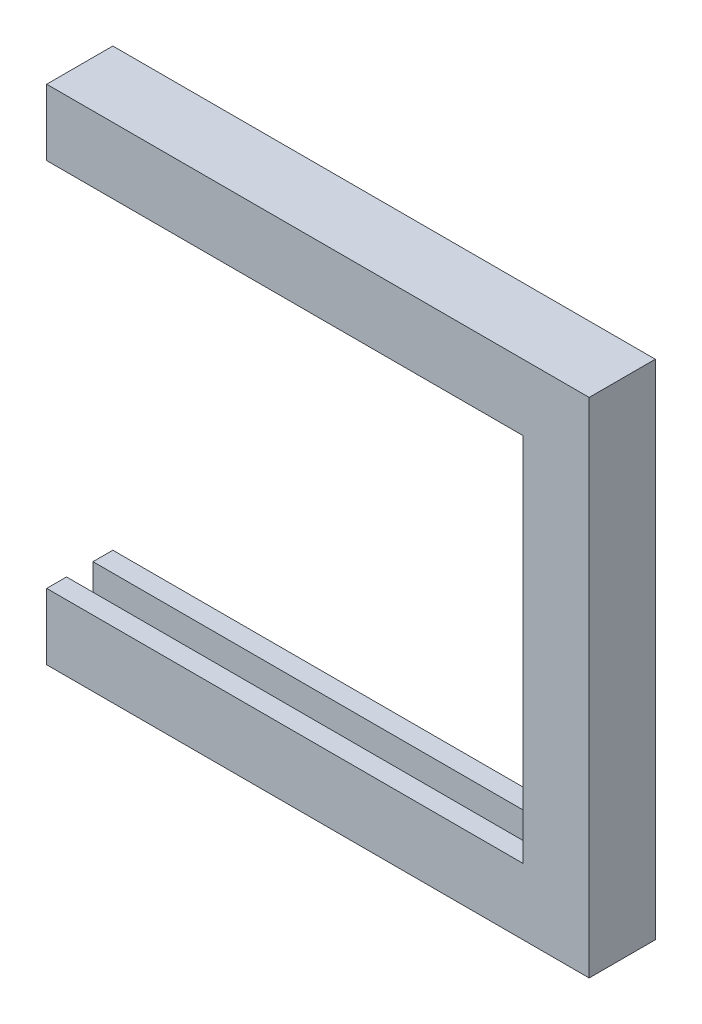
ISO-10303-21;
HEADER;
FILE_DESCRIPTION(('STEP AP214'),'2;1');
FILE_NAME('part.step','',(''),(''),'','','');
FILE_SCHEMA(('AUTOMOTIVE_DESIGN { 1 0 10303 214 1 1 1 1 }'));
ENDSEC;
DATA;
#1=APPLICATION_CONTEXT('core data for automotive mechanical design processes');
#2=APPLICATION_PROTOCOL_DEFINITION('international standard','automotive_design',2000,#1);
#3=PRODUCT_CONTEXT('',#1,'mechanical');
#4=PRODUCT('Part','Part','',(#3));
#5=PRODUCT_RELATED_PRODUCT_CATEGORY('part','',(#4));
#6=PRODUCT_DEFINITION_FORMATION('','',#4);
#7=PRODUCT_DEFINITION_CONTEXT('part definition',#1,'design');
#8=PRODUCT_DEFINITION('design','',#6,#7);
#9=PRODUCT_DEFINITION_SHAPE('','',#8);
#10=(LENGTH_UNIT() NAMED_UNIT(*) SI_UNIT(.MILLI.,.METRE.));
#11=(NAMED_UNIT(*) PLANE_ANGLE_UNIT() SI_UNIT($,.RADIAN.));
#12=(NAMED_UNIT(*) SI_UNIT($,.STERADIAN.) SOLID_ANGLE_UNIT());
#13=UNCERTAINTY_MEASURE_WITH_UNIT(LENGTH_MEASURE(1.E-05),#10,'distance_accuracy_value','');
#14=(GEOMETRIC_REPRESENTATION_CONTEXT(3) GLOBAL_UNCERTAINTY_ASSIGNED_CONTEXT((#13)) GLOBAL_UNIT_ASSIGNED_CONTEXT((#10,
#11,#12)) REPRESENTATION_CONTEXT('',''));
#15=CARTESIAN_POINT('',(0.,0.,0.));
#16=DIRECTION('',(0.,0.,1.));
#17=DIRECTION('',(1.,0.,0.));
#18=AXIS2_PLACEMENT_3D('',#15,#16,#17);
#19=CARTESIAN_POINT('',(0.,0.,5.));
#20=DIRECTION('',(1.,0.,0.));
#21=DIRECTION('',(0.,0.,-1.));
#22=AXIS2_PLACEMENT_3D('',#19,#20,#21);
#23=PLANE('',#22);
#24=DIRECTION('',(0.,-1.,0.));
#25=VECTOR('',#24,1.);
#26=CARTESIAN_POINT('',(0.,0.,5.));
#27=LINE('',#26,#25);
#28=CARTESIAN_POINT('',(0.,5.,5.));
#29=VERTEX_POINT('',#28);
#30=CARTESIAN_POINT('',(0.,0.,5.));
#31=VERTEX_POINT('',#30);
#32=EDGE_CURVE('E224',#29,#31,#27,.T.);
#33=ORIENTED_EDGE('',*,*,#32,.F.);
#34=DIRECTION('',(0.,0.,1.));
#35=VECTOR('',#34,1.);
#36=CARTESIAN_POINT('',(0.,5.,0.));
#37=LINE('',#36,#35);
#38=CARTESIAN_POINT('',(0.,5.,3.5));
#39=VERTEX_POINT('',#38);
#40=EDGE_CURVE('E270',#39,#29,#37,.T.);
#41=ORIENTED_EDGE('',*,*,#40,.F.);
#42=DIRECTION('',(0.,1.,0.));
#43=VECTOR('',#42,1.);
#44=CARTESIAN_POINT('',(0.,3.,3.5));
#45=LINE('',#44,#43);
#46=CARTESIAN_POINT('',(0.,3.,3.5));
#47=VERTEX_POINT('',#46);
#48=EDGE_CURVE('E198',#47,#39,#45,.T.);
#49=ORIENTED_EDGE('',*,*,#48,.F.);
#50=DIRECTION('',(0.,0.,1.));
#51=VECTOR('',#50,1.);
#52=CARTESIAN_POINT('',(0.,3.,3.5));
#53=LINE('',#52,#51);
#54=CARTESIAN_POINT('',(0.,3.,1.5));
#55=VERTEX_POINT('',#54);
#56=EDGE_CURVE('E208',#55,#47,#53,.T.);
#57=ORIENTED_EDGE('',*,*,#56,.F.);
#58=DIRECTION('',(0.,-1.,0.));
#59=VECTOR('',#58,1.);
#60=CARTESIAN_POINT('',(0.,3.,1.5));
#61=LINE('',#60,#59);
#62=CARTESIAN_POINT('',(0.,5.,1.5));
#63=VERTEX_POINT('',#62);
#64=EDGE_CURVE('E204',#63,#55,#61,.T.);
#65=ORIENTED_EDGE('',*,*,#64,.F.);
#66=CARTESIAN_POINT('',(0.,5.,0.));
#67=VERTEX_POINT('',#66);
#68=EDGE_CURVE('E257',#67,#63,#37,.T.);
#69=ORIENTED_EDGE('',*,*,#68,.F.);
#70=DIRECTION('',(0.,-1.,0.));
#71=VECTOR('',#70,1.);
#72=CARTESIAN_POINT('',(0.,0.,0.));
#73=LINE('',#72,#71);
#74=CARTESIAN_POINT('',(0.,0.,0.));
#75=VERTEX_POINT('',#74);
#76=EDGE_CURVE('E167',#67,#75,#73,.T.);
#77=ORIENTED_EDGE('',*,*,#76,.T.);
#78=DIRECTION('',(0.,0.,-1.));
#79=VECTOR('',#78,1.);
#80=CARTESIAN_POINT('',(0.,0.,5.));
#81=LINE('',#80,#79);
#82=EDGE_CURVE('E248',#31,#75,#81,.T.);
#83=ORIENTED_EDGE('',*,*,#82,.F.);
#84=EDGE_LOOP('',(#33,#41,#49,#57,#65,#69,#77,#83));
#85=FACE_BOUND('',#84,.T.);
#86=ADVANCED_FACE('F35',(#85),#23,.F.);
#87=CARTESIAN_POINT('',(0.,38.,0.));
#88=VERTEX_POINT('',#87);
#89=CARTESIAN_POINT('',(0.,33.,0.));
#90=VERTEX_POINT('',#89);
#91=EDGE_CURVE('E231',#88,#90,#73,.T.);
#92=ORIENTED_EDGE('',*,*,#91,.T.);
#93=DIRECTION('',(0.,0.,-1.));
#94=VECTOR('',#93,1.);
#95=CARTESIAN_POINT('',(0.,33.,0.));
#96=LINE('',#95,#94);
#97=CARTESIAN_POINT('',(0.,33.,1.5));
#98=VERTEX_POINT('',#97);
#99=EDGE_CURVE('E273',#98,#90,#96,.T.);
#100=ORIENTED_EDGE('',*,*,#99,.F.);
#101=CARTESIAN_POINT('',(0.,35.,1.5));
#102=VERTEX_POINT('',#101);
#103=EDGE_CURVE('E205',#102,#98,#61,.T.);
#104=ORIENTED_EDGE('',*,*,#103,.F.);
#105=DIRECTION('',(0.,0.,-1.));
#106=VECTOR('',#105,1.);
#107=CARTESIAN_POINT('',(0.,35.,3.49999999999999));
#108=LINE('',#107,#106);
#109=CARTESIAN_POINT('',(0.,35.,3.49999999999999));
#110=VERTEX_POINT('',#109);
#111=EDGE_CURVE('E201',#110,#102,#108,.T.);
#112=ORIENTED_EDGE('',*,*,#111,.F.);
#113=CARTESIAN_POINT('',(0.,33.,3.49999999999999));
#114=VERTEX_POINT('',#113);
#115=EDGE_CURVE('E183',#114,#110,#45,.T.);
#116=ORIENTED_EDGE('',*,*,#115,.F.);
#117=CARTESIAN_POINT('',(0.,33.,5.));
#118=VERTEX_POINT('',#117);
#119=EDGE_CURVE('E275',#118,#114,#96,.T.);
#120=ORIENTED_EDGE('',*,*,#119,.F.);
#121=CARTESIAN_POINT('',(0.,38.,5.));
#122=VERTEX_POINT('',#121);
#123=EDGE_CURVE('E220',#122,#118,#27,.T.);
#124=ORIENTED_EDGE('',*,*,#123,.F.);
#125=DIRECTION('',(0.,0.,-1.));
#126=VECTOR('',#125,1.);
#127=CARTESIAN_POINT('',(0.,38.,5.));
#128=LINE('',#127,#126);
#129=EDGE_CURVE('E230',#122,#88,#128,.T.);
#130=ORIENTED_EDGE('',*,*,#129,.T.);
#131=EDGE_LOOP('',(#92,#100,#104,#112,#116,#120,#124,#130));
#132=FACE_BOUND('',#131,.T.);
#133=ADVANCED_FACE('F37',(#132),#23,.F.);
#134=CARTESIAN_POINT('',(0.,0.,5.));
#135=DIRECTION('',(0.,1.,0.));
#136=DIRECTION('',(0.,0.,1.));
#137=AXIS2_PLACEMENT_3D('',#134,#135,#136);
#138=PLANE('',#137);
#139=DIRECTION('',(1.,0.,0.));
#140=VECTOR('',#139,1.);
#141=CARTESIAN_POINT('',(0.,0.,0.));
#142=LINE('',#141,#140);
#143=CARTESIAN_POINT('',(41.,0.,0.));
#144=VERTEX_POINT('',#143);
#145=EDGE_CURVE('E234',#75,#144,#142,.T.);
#146=ORIENTED_EDGE('',*,*,#145,.T.);
#147=DIRECTION('',(0.,0.,-1.));
#148=VECTOR('',#147,1.);
#149=CARTESIAN_POINT('',(41.,0.,5.));
#150=LINE('',#149,#148);
#151=CARTESIAN_POINT('',(41.,0.,5.));
#152=VERTEX_POINT('',#151);
#153=EDGE_CURVE('E245',#152,#144,#150,.T.);
#154=ORIENTED_EDGE('',*,*,#153,.F.);
#155=DIRECTION('',(1.,0.,0.));
#156=VECTOR('',#155,1.);
#157=CARTESIAN_POINT('',(0.,0.,5.));
#158=LINE('',#157,#156);
#159=EDGE_CURVE('E223',#31,#152,#158,.T.);
#160=ORIENTED_EDGE('',*,*,#159,.F.);
#161=ORIENTED_EDGE('',*,*,#82,.T.);
#162=EDGE_LOOP('',(#146,#154,#160,#161));
#163=FACE_BOUND('',#162,.T.);
#164=ADVANCED_FACE('F324',(#163),#138,.F.);
#165=CARTESIAN_POINT('',(41.,0.,5.));
#166=DIRECTION('',(-1.,0.,0.));
#167=DIRECTION('',(0.,0.,1.));
#168=AXIS2_PLACEMENT_3D('',#165,#166,#167);
#169=PLANE('',#168);
#170=DIRECTION('',(0.,1.,0.));
#171=VECTOR('',#170,1.);
#172=CARTESIAN_POINT('',(41.,0.,0.));
#173=LINE('',#172,#171);
#174=CARTESIAN_POINT('',(41.,38.,0.));
#175=VERTEX_POINT('',#174);
#176=EDGE_CURVE('E236',#144,#175,#173,.T.);
#177=ORIENTED_EDGE('',*,*,#176,.T.);
#178=DIRECTION('',(0.,0.,-1.));
#179=VECTOR('',#178,1.);
#180=CARTESIAN_POINT('',(41.,38.,5.));
#181=LINE('',#180,#179);
#182=CARTESIAN_POINT('',(41.,38.,5.));
#183=VERTEX_POINT('',#182);
#184=EDGE_CURVE('E242',#183,#175,#181,.T.);
#185=ORIENTED_EDGE('',*,*,#184,.F.);
#186=DIRECTION('',(0.,1.,0.));
#187=VECTOR('',#186,1.);
#188=CARTESIAN_POINT('',(41.,0.,5.));
#189=LINE('',#188,#187);
#190=EDGE_CURVE('E226',#152,#183,#189,.T.);
#191=ORIENTED_EDGE('',*,*,#190,.F.);
#192=ORIENTED_EDGE('',*,*,#153,.T.);
#193=EDGE_LOOP('',(#177,#185,#191,#192));
#194=FACE_BOUND('',#193,.T.);
#195=ADVANCED_FACE('F328',(#194),#169,.F.);
#196=CARTESIAN_POINT('',(0.,38.,5.));
#197=DIRECTION('',(0.,-1.,0.));
#198=DIRECTION('',(0.,0.,-1.));
#199=AXIS2_PLACEMENT_3D('',#196,#197,#198);
#200=PLANE('',#199);
#201=DIRECTION('',(-1.,0.,0.));
#202=VECTOR('',#201,1.);
#203=CARTESIAN_POINT('',(0.,38.,0.));
#204=LINE('',#203,#202);
#205=EDGE_CURVE('E238',#175,#88,#204,.T.);
#206=ORIENTED_EDGE('',*,*,#205,.T.);
#207=ORIENTED_EDGE('',*,*,#129,.F.);
#208=DIRECTION('',(-1.,0.,0.));
#209=VECTOR('',#208,1.);
#210=CARTESIAN_POINT('',(0.,38.,5.));
#211=LINE('',#210,#209);
#212=EDGE_CURVE('E228',#183,#122,#211,.T.);
#213=ORIENTED_EDGE('',*,*,#212,.F.);
#214=ORIENTED_EDGE('',*,*,#184,.T.);
#215=EDGE_LOOP('',(#206,#207,#213,#214));
#216=FACE_BOUND('',#215,.T.);
#217=ADVANCED_FACE('F292',(#216),#200,.F.);
#218=CARTESIAN_POINT('',(0.,0.,5.));
#219=DIRECTION('',(0.,0.,-1.));
#220=DIRECTION('',(-1.,0.,0.));
#221=AXIS2_PLACEMENT_3D('',#218,#219,#220);
#222=PLANE('',#221);
#223=DIRECTION('',(0.,-1.,0.));
#224=VECTOR('',#223,1.);
#225=CARTESIAN_POINT('',(36.,29.5,5.));
#226=LINE('',#225,#224);
#227=CARTESIAN_POINT('',(36.,33.,5.));
#228=VERTEX_POINT('',#227);
#229=CARTESIAN_POINT('',(36.,5.,5.));
#230=VERTEX_POINT('',#229);
#231=EDGE_CURVE('E153',#228,#230,#226,.T.);
#232=ORIENTED_EDGE('',*,*,#231,.T.);
#233=DIRECTION('',(-1.,0.,0.));
#234=VECTOR('',#233,1.);
#235=CARTESIAN_POINT('',(36.,5.,5.));
#236=LINE('',#235,#234);
#237=EDGE_CURVE('E168',#230,#29,#236,.T.);
#238=ORIENTED_EDGE('',*,*,#237,.T.);
#239=ORIENTED_EDGE('',*,*,#32,.T.);
#240=ORIENTED_EDGE('',*,*,#159,.T.);
#241=ORIENTED_EDGE('',*,*,#190,.T.);
#242=ORIENTED_EDGE('',*,*,#212,.T.);
#243=ORIENTED_EDGE('',*,*,#123,.T.);
#244=DIRECTION('',(-1.,0.,0.));
#245=VECTOR('',#244,1.);
#246=CARTESIAN_POINT('',(36.,33.,5.));
#247=LINE('',#246,#245);
#248=EDGE_CURVE('E171',#228,#118,#247,.T.);
#249=ORIENTED_EDGE('',*,*,#248,.F.);
#250=EDGE_LOOP('',(#232,#238,#239,#240,#241,#242,#243,#249));
#251=FACE_BOUND('',#250,.T.);
#252=ADVANCED_FACE('F286',(#251),#222,.F.);
#253=CARTESIAN_POINT('',(0.,0.,0.));
#254=DIRECTION('',(0.,0.,-1.));
#255=DIRECTION('',(-1.,0.,0.));
#256=AXIS2_PLACEMENT_3D('',#253,#254,#255);
#257=PLANE('',#256);
#258=DIRECTION('',(-1.,0.,0.));
#259=VECTOR('',#258,1.);
#260=CARTESIAN_POINT('',(36.,5.,0.));
#261=LINE('',#260,#259);
#262=CARTESIAN_POINT('',(36.,5.,0.));
#263=VERTEX_POINT('',#262);
#264=EDGE_CURVE('E158',#263,#67,#261,.T.);
#265=ORIENTED_EDGE('',*,*,#264,.F.);
#266=DIRECTION('',(0.,-1.,0.));
#267=VECTOR('',#266,1.);
#268=CARTESIAN_POINT('',(36.,29.5,0.));
#269=LINE('',#268,#267);
#270=CARTESIAN_POINT('',(36.,33.,0.));
#271=VERTEX_POINT('',#270);
#272=EDGE_CURVE('E145',#271,#263,#269,.T.);
#273=ORIENTED_EDGE('',*,*,#272,.F.);
#274=DIRECTION('',(-1.,0.,0.));
#275=VECTOR('',#274,1.);
#276=CARTESIAN_POINT('',(36.,33.,0.));
#277=LINE('',#276,#275);
#278=EDGE_CURVE('E180',#271,#90,#277,.T.);
#279=ORIENTED_EDGE('',*,*,#278,.T.);
#280=ORIENTED_EDGE('',*,*,#91,.F.);
#281=ORIENTED_EDGE('',*,*,#205,.F.);
#282=ORIENTED_EDGE('',*,*,#176,.F.);
#283=ORIENTED_EDGE('',*,*,#145,.F.);
#284=ORIENTED_EDGE('',*,*,#76,.F.);
#285=EDGE_LOOP('',(#265,#273,#279,#280,#281,#282,#283,#284));
#286=FACE_BOUND('',#285,.T.);
#287=ADVANCED_FACE('F165',(#286),#257,.T.);
#288=CARTESIAN_POINT('',(36.,29.5,5.));
#289=DIRECTION('',(1.,0.,0.));
#290=DIRECTION('',(0.,0.,-1.));
#291=AXIS2_PLACEMENT_3D('',#288,#289,#290);
#292=PLANE('',#291);
#293=ORIENTED_EDGE('',*,*,#272,.T.);
#294=DIRECTION('',(0.,0.,1.));
#295=VECTOR('',#294,1.);
#296=CARTESIAN_POINT('',(36.,5.,0.));
#297=LINE('',#296,#295);
#298=CARTESIAN_POINT('',(36.,5.,1.5));
#299=VERTEX_POINT('',#298);
#300=EDGE_CURVE('E57',#263,#299,#297,.T.);
#301=ORIENTED_EDGE('',*,*,#300,.T.);
#302=DIRECTION('',(0.,-1.,0.));
#303=VECTOR('',#302,1.);
#304=CARTESIAN_POINT('',(36.,3.,1.5));
#305=LINE('',#304,#303);
#306=CARTESIAN_POINT('',(36.,3.,1.5));
#307=VERTEX_POINT('',#306);
#308=EDGE_CURVE('E191',#299,#307,#305,.T.);
#309=ORIENTED_EDGE('',*,*,#308,.T.);
#310=DIRECTION('',(0.,0.,1.));
#311=VECTOR('',#310,1.);
#312=CARTESIAN_POINT('',(36.,3.,3.5));
#313=LINE('',#312,#311);
#314=CARTESIAN_POINT('',(36.,3.,3.5));
#315=VERTEX_POINT('',#314);
#316=EDGE_CURVE('E194',#307,#315,#313,.T.);
#317=ORIENTED_EDGE('',*,*,#316,.T.);
#318=DIRECTION('',(0.,1.,0.));
#319=VECTOR('',#318,1.);
#320=CARTESIAN_POINT('',(36.,3.,3.5));
#321=LINE('',#320,#319);
#322=CARTESIAN_POINT('',(36.,5.,3.5));
#323=VERTEX_POINT('',#322);
#324=EDGE_CURVE('E184',#315,#323,#321,.T.);
#325=ORIENTED_EDGE('',*,*,#324,.T.);
#326=EDGE_CURVE('E162',#323,#230,#297,.T.);
#327=ORIENTED_EDGE('',*,*,#326,.T.);
#328=ORIENTED_EDGE('',*,*,#231,.F.);
#329=DIRECTION('',(0.,0.,-1.));
#330=VECTOR('',#329,1.);
#331=CARTESIAN_POINT('',(36.,33.,0.));
#332=LINE('',#331,#330);
#333=CARTESIAN_POINT('',(36.,33.,3.49999999999999));
#334=VERTEX_POINT('',#333);
#335=EDGE_CURVE('E50',#228,#334,#332,.T.);
#336=ORIENTED_EDGE('',*,*,#335,.T.);
#337=CARTESIAN_POINT('',(36.,35.,3.49999999999999));
#338=VERTEX_POINT('',#337);
#339=EDGE_CURVE('E188',#334,#338,#321,.T.);
#340=ORIENTED_EDGE('',*,*,#339,.T.);
#341=DIRECTION('',(0.,0.,-1.));
#342=VECTOR('',#341,1.);
#343=CARTESIAN_POINT('',(36.,35.,3.49999999999999));
#344=LINE('',#343,#342);
#345=CARTESIAN_POINT('',(36.,35.,1.5));
#346=VERTEX_POINT('',#345);
#347=EDGE_CURVE('E187',#338,#346,#344,.T.);
#348=ORIENTED_EDGE('',*,*,#347,.T.);
#349=CARTESIAN_POINT('',(36.,33.,1.5));
#350=VERTEX_POINT('',#349);
#351=EDGE_CURVE('E192',#346,#350,#305,.T.);
#352=ORIENTED_EDGE('',*,*,#351,.T.);
#353=EDGE_CURVE('E148',#350,#271,#332,.T.);
#354=ORIENTED_EDGE('',*,*,#353,.T.);
#355=EDGE_LOOP('',(#293,#301,#309,#317,#325,#327,#328,#336,#340,#348,#352,#354));
#356=FACE_BOUND('',#355,.T.);
#357=ADVANCED_FACE('F146',(#356),#292,.F.);
#358=CARTESIAN_POINT('',(36.,3.,1.5));
#359=DIRECTION('',(0.,0.,-1.));
#360=DIRECTION('',(0.,1.,0.));
#361=AXIS2_PLACEMENT_3D('',#358,#359,#360);
#362=PLANE('',#361);
#363=ORIENTED_EDGE('',*,*,#103,.T.);
#364=DIRECTION('',(1.,0.,0.));
#365=VECTOR('',#364,1.);
#366=CARTESIAN_POINT('',(36.,33.,1.5));
#367=LINE('',#366,#365);
#368=EDGE_CURVE('E179',#98,#350,#367,.T.);
#369=ORIENTED_EDGE('',*,*,#368,.T.);
#370=ORIENTED_EDGE('',*,*,#351,.F.);
#371=DIRECTION('',(-1.,0.,0.));
#372=VECTOR('',#371,1.);
#373=CARTESIAN_POINT('',(36.,35.,1.5));
#374=LINE('',#373,#372);
#375=EDGE_CURVE('E215',#346,#102,#374,.T.);
#376=ORIENTED_EDGE('',*,*,#375,.T.);
#377=EDGE_LOOP('',(#363,#369,#370,#376));
#378=FACE_BOUND('',#377,.T.);
#379=ADVANCED_FACE('F301',(#378),#362,.F.);
#380=CARTESIAN_POINT('',(36.,3.,3.5));
#381=DIRECTION('',(0.,0.,1.));
#382=DIRECTION('',(0.,-1.,0.));
#383=AXIS2_PLACEMENT_3D('',#380,#381,#382);
#384=PLANE('',#383);
#385=ORIENTED_EDGE('',*,*,#339,.F.);
#386=DIRECTION('',(-1.,0.,0.));
#387=VECTOR('',#386,1.);
#388=CARTESIAN_POINT('',(36.,33.,3.49999999999999));
#389=LINE('',#388,#387);
#390=EDGE_CURVE('E11',#334,#114,#389,.T.);
#391=ORIENTED_EDGE('',*,*,#390,.T.);
#392=ORIENTED_EDGE('',*,*,#115,.T.);
#393=DIRECTION('',(-1.,0.,0.));
#394=VECTOR('',#393,1.);
#395=CARTESIAN_POINT('',(36.,35.,3.49999999999999));
#396=LINE('',#395,#394);
#397=EDGE_CURVE('E197',#338,#110,#396,.T.);
#398=ORIENTED_EDGE('',*,*,#397,.F.);
#399=EDGE_LOOP('',(#385,#391,#392,#398));
#400=FACE_BOUND('',#399,.T.);
#401=ADVANCED_FACE('F309',(#400),#384,.F.);
#402=CARTESIAN_POINT('',(36.,35.,3.49999999999999));
#403=DIRECTION('',(0.,1.,0.));
#404=DIRECTION('',(0.,0.,1.));
#405=AXIS2_PLACEMENT_3D('',#402,#403,#404);
#406=PLANE('',#405);
#407=ORIENTED_EDGE('',*,*,#111,.T.);
#408=ORIENTED_EDGE('',*,*,#375,.F.);
#409=ORIENTED_EDGE('',*,*,#347,.F.);
#410=ORIENTED_EDGE('',*,*,#397,.T.);
#411=EDGE_LOOP('',(#407,#408,#409,#410));
#412=FACE_BOUND('',#411,.T.);
#413=ADVANCED_FACE('F305',(#412),#406,.F.);
#414=ORIENTED_EDGE('',*,*,#48,.T.);
#415=DIRECTION('',(1.,0.,0.));
#416=VECTOR('',#415,1.);
#417=CARTESIAN_POINT('',(36.,5.,3.5));
#418=LINE('',#417,#416);
#419=EDGE_CURVE('E176',#39,#323,#418,.T.);
#420=ORIENTED_EDGE('',*,*,#419,.T.);
#421=ORIENTED_EDGE('',*,*,#324,.F.);
#422=DIRECTION('',(-1.,0.,0.));
#423=VECTOR('',#422,1.);
#424=CARTESIAN_POINT('',(36.,3.,3.5));
#425=LINE('',#424,#423);
#426=EDGE_CURVE('E154',#315,#47,#425,.T.);
#427=ORIENTED_EDGE('',*,*,#426,.T.);
#428=EDGE_LOOP('',(#414,#420,#421,#427));
#429=FACE_BOUND('',#428,.T.);
#430=ADVANCED_FACE('F267',(#429),#384,.F.);
#431=ORIENTED_EDGE('',*,*,#308,.F.);
#432=DIRECTION('',(-1.,0.,0.));
#433=VECTOR('',#432,1.);
#434=CARTESIAN_POINT('',(36.,5.,1.5));
#435=LINE('',#434,#433);
#436=EDGE_CURVE('E43',#299,#63,#435,.T.);
#437=ORIENTED_EDGE('',*,*,#436,.T.);
#438=ORIENTED_EDGE('',*,*,#64,.T.);
#439=DIRECTION('',(-1.,0.,0.));
#440=VECTOR('',#439,1.);
#441=CARTESIAN_POINT('',(36.,3.,1.5));
#442=LINE('',#441,#440);
#443=EDGE_CURVE('E212',#307,#55,#442,.T.);
#444=ORIENTED_EDGE('',*,*,#443,.F.);
#445=EDGE_LOOP('',(#431,#437,#438,#444));
#446=FACE_BOUND('',#445,.T.);
#447=ADVANCED_FACE('F252',(#446),#362,.F.);
#448=CARTESIAN_POINT('',(36.,3.,3.5));
#449=DIRECTION('',(0.,-1.,0.));
#450=DIRECTION('',(0.,0.,-1.));
#451=AXIS2_PLACEMENT_3D('',#448,#449,#450);
#452=PLANE('',#451);
#453=ORIENTED_EDGE('',*,*,#56,.T.);
#454=ORIENTED_EDGE('',*,*,#426,.F.);
#455=ORIENTED_EDGE('',*,*,#316,.F.);
#456=ORIENTED_EDGE('',*,*,#443,.T.);
#457=EDGE_LOOP('',(#453,#454,#455,#456));
#458=FACE_BOUND('',#457,.T.);
#459=ADVANCED_FACE('F261',(#458),#452,.F.);
#460=CARTESIAN_POINT('',(36.,5.,0.));
#461=DIRECTION('',(0.,-1.,0.));
#462=DIRECTION('',(0.,0.,-1.));
#463=AXIS2_PLACEMENT_3D('',#460,#461,#462);
#464=PLANE('',#463);
#465=ORIENTED_EDGE('',*,*,#300,.F.);
#466=ORIENTED_EDGE('',*,*,#264,.T.);
#467=ORIENTED_EDGE('',*,*,#68,.T.);
#468=ORIENTED_EDGE('',*,*,#436,.F.);
#469=EDGE_LOOP('',(#465,#466,#467,#468));
#470=FACE_BOUND('',#469,.T.);
#471=ADVANCED_FACE('F157',(#470),#464,.F.);
#472=ORIENTED_EDGE('',*,*,#40,.T.);
#473=ORIENTED_EDGE('',*,*,#237,.F.);
#474=ORIENTED_EDGE('',*,*,#326,.F.);
#475=ORIENTED_EDGE('',*,*,#419,.F.);
#476=EDGE_LOOP('',(#472,#473,#474,#475));
#477=FACE_BOUND('',#476,.T.);
#478=ADVANCED_FACE('F269',(#477),#464,.F.);
#479=CARTESIAN_POINT('',(36.,33.,0.));
#480=DIRECTION('',(0.,1.,0.));
#481=DIRECTION('',(0.,0.,1.));
#482=AXIS2_PLACEMENT_3D('',#479,#480,#481);
#483=PLANE('',#482);
#484=ORIENTED_EDGE('',*,*,#335,.F.);
#485=ORIENTED_EDGE('',*,*,#248,.T.);
#486=ORIENTED_EDGE('',*,*,#119,.T.);
#487=ORIENTED_EDGE('',*,*,#390,.F.);
#488=EDGE_LOOP('',(#484,#485,#486,#487));
#489=FACE_BOUND('',#488,.T.);
#490=ADVANCED_FACE('F280',(#489),#483,.F.);
#491=ORIENTED_EDGE('',*,*,#99,.T.);
#492=ORIENTED_EDGE('',*,*,#278,.F.);
#493=ORIENTED_EDGE('',*,*,#353,.F.);
#494=ORIENTED_EDGE('',*,*,#368,.F.);
#495=EDGE_LOOP('',(#491,#492,#493,#494));
#496=FACE_BOUND('',#495,.T.);
#497=ADVANCED_FACE('F298',(#496),#483,.F.);
#498=CLOSED_SHELL('',(#86,#133,#164,#195,#217,#252,#287,#357,#379,#401,#413,#430,#447,#459,#471,
#478,#490,#497));
#499=MANIFOLD_SOLID_BREP('B2',#498);
#500=ADVANCED_BREP_SHAPE_REPRESENTATION('',(#18,#499),#14);
#501=SHAPE_DEFINITION_REPRESENTATION(#9,#500);
ENDSEC;
END-ISO-10303-21;
